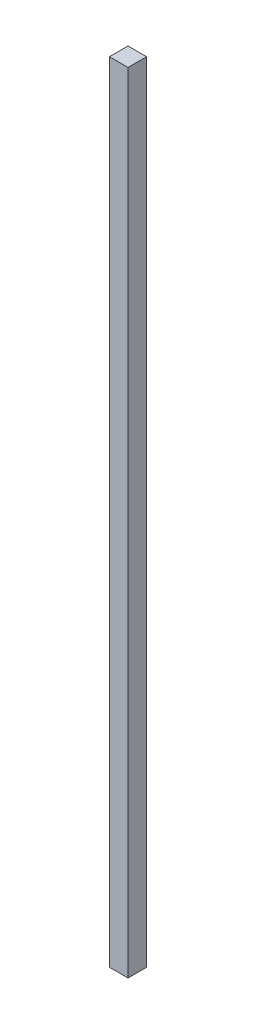
ISO-10303-21;
HEADER;
FILE_DESCRIPTION(('STEP AP214'),'2;1');
FILE_NAME('part.step','',(''),(''),'','','');
FILE_SCHEMA(('AUTOMOTIVE_DESIGN { 1 0 10303 214 1 1 1 1 }'));
ENDSEC;
DATA;
#1=APPLICATION_CONTEXT('core data for automotive mechanical design processes');
#2=APPLICATION_PROTOCOL_DEFINITION('international standard','automotive_design',2000,#1);
#3=PRODUCT_CONTEXT('',#1,'mechanical');
#4=PRODUCT('Part','Part','',(#3));
#5=PRODUCT_RELATED_PRODUCT_CATEGORY('part','',(#4));
#6=PRODUCT_DEFINITION_FORMATION('','',#4);
#7=PRODUCT_DEFINITION_CONTEXT('part definition',#1,'design');
#8=PRODUCT_DEFINITION('design','',#6,#7);
#9=PRODUCT_DEFINITION_SHAPE('','',#8);
#10=(LENGTH_UNIT() NAMED_UNIT(*) SI_UNIT(.MILLI.,.METRE.));
#11=(NAMED_UNIT(*) PLANE_ANGLE_UNIT() SI_UNIT($,.RADIAN.));
#12=(NAMED_UNIT(*) SI_UNIT($,.STERADIAN.) SOLID_ANGLE_UNIT());
#13=UNCERTAINTY_MEASURE_WITH_UNIT(LENGTH_MEASURE(1.E-05),#10,'distance_accuracy_value','');
#14=(GEOMETRIC_REPRESENTATION_CONTEXT(3) GLOBAL_UNCERTAINTY_ASSIGNED_CONTEXT((#13)) GLOBAL_UNIT_ASSIGNED_CONTEXT((#10,
#11,#12)) REPRESENTATION_CONTEXT('',''));
#15=CARTESIAN_POINT('',(0.,0.,0.));
#16=DIRECTION('',(0.,0.,1.));
#17=DIRECTION('',(1.,0.,0.));
#18=AXIS2_PLACEMENT_3D('',#15,#16,#17);
#19=CARTESIAN_POINT('',(566.,640.,-604.));
#20=DIRECTION('',(-1.,0.,0.));
#21=DIRECTION('',(0.,0.,1.));
#22=AXIS2_PLACEMENT_3D('',#19,#20,#21);
#23=PLANE('',#22);
#24=DIRECTION('',(0.,-1.,0.));
#25=VECTOR('',#24,1.);
#26=CARTESIAN_POINT('',(566.,640.,-596.));
#27=LINE('',#26,#25);
#28=CARTESIAN_POINT('',(566.,980.,-596.));
#29=VERTEX_POINT('',#28);
#30=CARTESIAN_POINT('',(566.,640.,-596.));
#31=VERTEX_POINT('',#30);
#32=EDGE_CURVE('E103',#29,#31,#27,.T.);
#33=ORIENTED_EDGE('',*,*,#32,.F.);
#34=DIRECTION('',(0.,0.,1.));
#35=VECTOR('',#34,1.);
#36=CARTESIAN_POINT('',(566.,980.,-604.));
#37=LINE('',#36,#35);
#38=CARTESIAN_POINT('',(566.,980.,-604.));
#39=VERTEX_POINT('',#38);
#40=EDGE_CURVE('E11',#39,#29,#37,.T.);
#41=ORIENTED_EDGE('',*,*,#40,.F.);
#42=DIRECTION('',(0.,-1.,0.));
#43=VECTOR('',#42,1.);
#44=CARTESIAN_POINT('',(566.,640.,-604.));
#45=LINE('',#44,#43);
#46=CARTESIAN_POINT('',(566.,640.,-604.));
#47=VERTEX_POINT('',#46);
#48=EDGE_CURVE('E97',#39,#47,#45,.T.);
#49=ORIENTED_EDGE('',*,*,#48,.T.);
#50=DIRECTION('',(0.,0.,1.));
#51=VECTOR('',#50,1.);
#52=CARTESIAN_POINT('',(566.,640.,-604.));
#53=LINE('',#52,#51);
#54=EDGE_CURVE('E42',#47,#31,#53,.T.);
#55=ORIENTED_EDGE('',*,*,#54,.T.);
#56=EDGE_LOOP('',(#33,#41,#49,#55));
#57=FACE_BOUND('',#56,.T.);
#58=ADVANCED_FACE('F39',(#57),#23,.T.);
#59=CARTESIAN_POINT('',(566.,980.,-604.));
#60=DIRECTION('',(0.,1.,0.));
#61=DIRECTION('',(0.,0.,1.));
#62=AXIS2_PLACEMENT_3D('',#59,#60,#61);
#63=PLANE('',#62);
#64=DIRECTION('',(-1.,0.,0.));
#65=VECTOR('',#64,1.);
#66=CARTESIAN_POINT('',(566.,980.,-596.));
#67=LINE('',#66,#65);
#68=CARTESIAN_POINT('',(574.,980.,-596.));
#69=VERTEX_POINT('',#68);
#70=EDGE_CURVE('E99',#69,#29,#67,.T.);
#71=ORIENTED_EDGE('',*,*,#70,.F.);
#72=DIRECTION('',(0.,0.,1.));
#73=VECTOR('',#72,1.);
#74=CARTESIAN_POINT('',(574.,980.,-604.));
#75=LINE('',#74,#73);
#76=CARTESIAN_POINT('',(574.,980.,-604.));
#77=VERTEX_POINT('',#76);
#78=EDGE_CURVE('E48',#77,#69,#75,.T.);
#79=ORIENTED_EDGE('',*,*,#78,.F.);
#80=DIRECTION('',(-1.,0.,0.));
#81=VECTOR('',#80,1.);
#82=CARTESIAN_POINT('',(566.,980.,-604.));
#83=LINE('',#82,#81);
#84=EDGE_CURVE('E94',#77,#39,#83,.T.);
#85=ORIENTED_EDGE('',*,*,#84,.T.);
#86=ORIENTED_EDGE('',*,*,#40,.T.);
#87=EDGE_LOOP('',(#71,#79,#85,#86));
#88=FACE_BOUND('',#87,.T.);
#89=ADVANCED_FACE('F113',(#88),#63,.T.);
#90=CARTESIAN_POINT('',(574.,640.,-604.));
#91=DIRECTION('',(1.,0.,0.));
#92=DIRECTION('',(0.,0.,-1.));
#93=AXIS2_PLACEMENT_3D('',#90,#91,#92);
#94=PLANE('',#93);
#95=DIRECTION('',(0.,1.,0.));
#96=VECTOR('',#95,1.);
#97=CARTESIAN_POINT('',(574.,640.,-596.));
#98=LINE('',#97,#96);
#99=CARTESIAN_POINT('',(574.,640.,-596.));
#100=VERTEX_POINT('',#99);
#101=EDGE_CURVE('E89',#100,#69,#98,.T.);
#102=ORIENTED_EDGE('',*,*,#101,.F.);
#103=DIRECTION('',(0.,0.,1.));
#104=VECTOR('',#103,1.);
#105=CARTESIAN_POINT('',(574.,640.,-604.));
#106=LINE('',#105,#104);
#107=CARTESIAN_POINT('',(574.,640.,-604.));
#108=VERTEX_POINT('',#107);
#109=EDGE_CURVE('E84',#108,#100,#106,.T.);
#110=ORIENTED_EDGE('',*,*,#109,.F.);
#111=DIRECTION('',(0.,1.,0.));
#112=VECTOR('',#111,1.);
#113=CARTESIAN_POINT('',(574.,640.,-604.));
#114=LINE('',#113,#112);
#115=EDGE_CURVE('E87',#108,#77,#114,.T.);
#116=ORIENTED_EDGE('',*,*,#115,.T.);
#117=ORIENTED_EDGE('',*,*,#78,.T.);
#118=EDGE_LOOP('',(#102,#110,#116,#117));
#119=FACE_BOUND('',#118,.T.);
#120=ADVANCED_FACE('F86',(#119),#94,.T.);
#121=CARTESIAN_POINT('',(566.,640.,-604.));
#122=DIRECTION('',(0.,-1.,0.));
#123=DIRECTION('',(0.,0.,-1.));
#124=AXIS2_PLACEMENT_3D('',#121,#122,#123);
#125=PLANE('',#124);
#126=DIRECTION('',(1.,0.,0.));
#127=VECTOR('',#126,1.);
#128=CARTESIAN_POINT('',(566.,640.,-596.));
#129=LINE('',#128,#127);
#130=EDGE_CURVE('E106',#31,#100,#129,.T.);
#131=ORIENTED_EDGE('',*,*,#130,.F.);
#132=ORIENTED_EDGE('',*,*,#54,.F.);
#133=DIRECTION('',(1.,0.,0.));
#134=VECTOR('',#133,1.);
#135=CARTESIAN_POINT('',(566.,640.,-604.));
#136=LINE('',#135,#134);
#137=EDGE_CURVE('E93',#47,#108,#136,.T.);
#138=ORIENTED_EDGE('',*,*,#137,.T.);
#139=ORIENTED_EDGE('',*,*,#109,.T.);
#140=EDGE_LOOP('',(#131,#132,#138,#139));
#141=FACE_BOUND('',#140,.T.);
#142=ADVANCED_FACE('F96',(#141),#125,.T.);
#143=CARTESIAN_POINT('',(0.,0.,-604.));
#144=DIRECTION('',(0.,0.,-1.));
#145=DIRECTION('',(-1.,0.,0.));
#146=AXIS2_PLACEMENT_3D('',#143,#144,#145);
#147=PLANE('',#146);
#148=ORIENTED_EDGE('',*,*,#48,.F.);
#149=ORIENTED_EDGE('',*,*,#84,.F.);
#150=ORIENTED_EDGE('',*,*,#115,.F.);
#151=ORIENTED_EDGE('',*,*,#137,.F.);
#152=EDGE_LOOP('',(#148,#149,#150,#151));
#153=FACE_BOUND('',#152,.T.);
#154=ADVANCED_FACE('F92',(#153),#147,.T.);
#155=CARTESIAN_POINT('',(0.,0.,-596.));
#156=DIRECTION('',(0.,0.,-1.));
#157=DIRECTION('',(-1.,0.,0.));
#158=AXIS2_PLACEMENT_3D('',#155,#156,#157);
#159=PLANE('',#158);
#160=ORIENTED_EDGE('',*,*,#32,.T.);
#161=ORIENTED_EDGE('',*,*,#130,.T.);
#162=ORIENTED_EDGE('',*,*,#101,.T.);
#163=ORIENTED_EDGE('',*,*,#70,.T.);
#164=EDGE_LOOP('',(#160,#161,#162,#163));
#165=FACE_BOUND('',#164,.T.);
#166=ADVANCED_FACE('F112',(#165),#159,.F.);
#167=CLOSED_SHELL('',(#58,#89,#120,#142,#154,#166));
#168=MANIFOLD_SOLID_BREP('B2',#167);
#169=ADVANCED_BREP_SHAPE_REPRESENTATION('',(#18,#168),#14);
#170=SHAPE_DEFINITION_REPRESENTATION(#9,#169);
ENDSEC;
END-ISO-10303-21;
